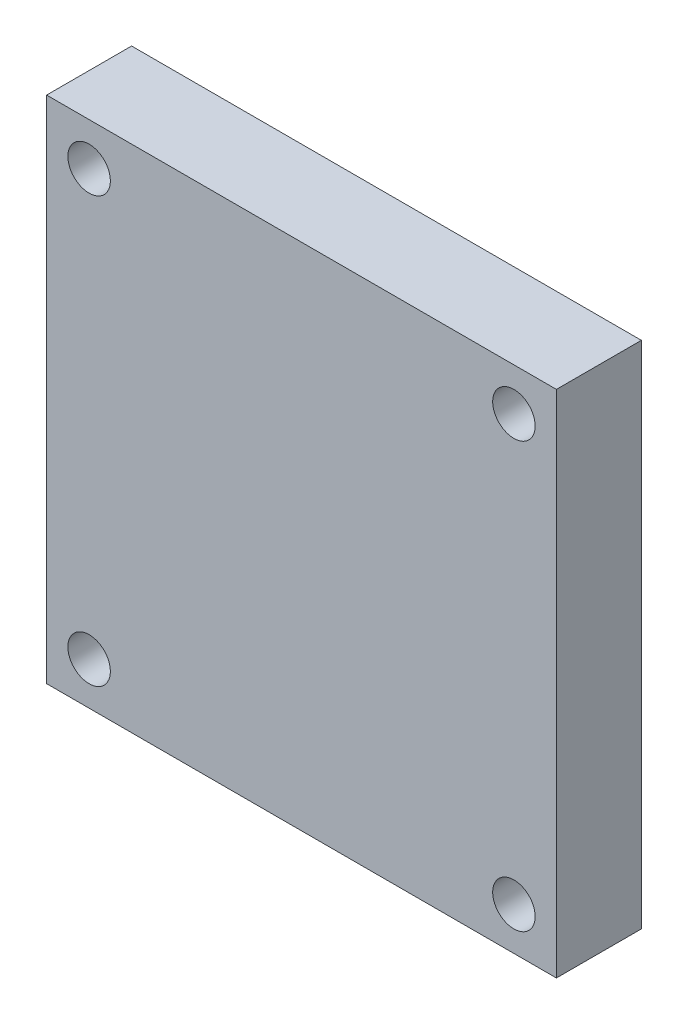
ISO-10303-21;
HEADER;
FILE_DESCRIPTION(('STEP AP214'),'2;1');
FILE_NAME('part.step','',(''),(''),'','','');
FILE_SCHEMA(('AUTOMOTIVE_DESIGN { 1 0 10303 214 1 1 1 1 }'));
ENDSEC;
DATA;
#1=APPLICATION_CONTEXT('core data for automotive mechanical design processes');
#2=APPLICATION_PROTOCOL_DEFINITION('international standard','automotive_design',2000,#1);
#3=PRODUCT_CONTEXT('',#1,'mechanical');
#4=PRODUCT('Part','Part','',(#3));
#5=PRODUCT_RELATED_PRODUCT_CATEGORY('part','',(#4));
#6=PRODUCT_DEFINITION_FORMATION('','',#4);
#7=PRODUCT_DEFINITION_CONTEXT('part definition',#1,'design');
#8=PRODUCT_DEFINITION('design','',#6,#7);
#9=PRODUCT_DEFINITION_SHAPE('','',#8);
#10=(LENGTH_UNIT() NAMED_UNIT(*) SI_UNIT(.MILLI.,.METRE.));
#11=(NAMED_UNIT(*) PLANE_ANGLE_UNIT() SI_UNIT($,.RADIAN.));
#12=(NAMED_UNIT(*) SI_UNIT($,.STERADIAN.) SOLID_ANGLE_UNIT());
#13=UNCERTAINTY_MEASURE_WITH_UNIT(LENGTH_MEASURE(1.E-05),#10,'distance_accuracy_value','');
#14=(GEOMETRIC_REPRESENTATION_CONTEXT(3) GLOBAL_UNCERTAINTY_ASSIGNED_CONTEXT((#13)) GLOBAL_UNIT_ASSIGNED_CONTEXT((#10,
#11,#12)) REPRESENTATION_CONTEXT('',''));
#15=CARTESIAN_POINT('',(0.,0.,0.));
#16=DIRECTION('',(0.,0.,1.));
#17=DIRECTION('',(1.,0.,0.));
#18=AXIS2_PLACEMENT_3D('',#15,#16,#17);
#19=CARTESIAN_POINT('',(0.,0.,10.));
#20=DIRECTION('',(0.,0.,-1.));
#21=DIRECTION('',(-1.,0.,0.));
#22=AXIS2_PLACEMENT_3D('',#19,#20,#21);
#23=PLANE('',#22);
#24=DIRECTION('',(0.,1.,0.));
#25=VECTOR('',#24,1.);
#26=CARTESIAN_POINT('',(30.,-30.,10.));
#27=LINE('',#26,#25);
#28=CARTESIAN_POINT('',(30.,-30.,10.));
#29=VERTEX_POINT('',#28);
#30=CARTESIAN_POINT('',(30.,30.,10.));
#31=VERTEX_POINT('',#30);
#32=EDGE_CURVE('E98',#29,#31,#27,.T.);
#33=ORIENTED_EDGE('',*,*,#32,.T.);
#34=DIRECTION('',(-1.,0.,0.));
#35=VECTOR('',#34,1.);
#36=CARTESIAN_POINT('',(-30.,30.,10.));
#37=LINE('',#36,#35);
#38=CARTESIAN_POINT('',(-30.,30.,10.));
#39=VERTEX_POINT('',#38);
#40=EDGE_CURVE('E93',#31,#39,#37,.T.);
#41=ORIENTED_EDGE('',*,*,#40,.T.);
#42=DIRECTION('',(0.,-1.,0.));
#43=VECTOR('',#42,1.);
#44=CARTESIAN_POINT('',(-30.,-30.,10.));
#45=LINE('',#44,#43);
#46=CARTESIAN_POINT('',(-30.,-30.,10.));
#47=VERTEX_POINT('',#46);
#48=EDGE_CURVE('E96',#39,#47,#45,.T.);
#49=ORIENTED_EDGE('',*,*,#48,.T.);
#50=DIRECTION('',(1.,0.,0.));
#51=VECTOR('',#50,1.);
#52=CARTESIAN_POINT('',(-30.,-30.,10.));
#53=LINE('',#52,#51);
#54=EDGE_CURVE('E63',#47,#29,#53,.T.);
#55=ORIENTED_EDGE('',*,*,#54,.T.);
#56=EDGE_LOOP('',(#33,#41,#49,#55));
#57=FACE_BOUND('',#56,.T.);
#58=CARTESIAN_POINT('',(-25.,25.,10.));
#59=DIRECTION('',(0.,0.,1.));
#60=DIRECTION('',(1.,0.,0.));
#61=AXIS2_PLACEMENT_3D('',#58,#59,#60);
#62=CIRCLE('',#61,2.5);
#63=CARTESIAN_POINT('',(-22.5,25.,10.));
#64=VERTEX_POINT('',#63);
#65=EDGE_CURVE('E118',#64,#64,#62,.T.);
#66=ORIENTED_EDGE('',*,*,#65,.F.);
#67=EDGE_LOOP('',(#66));
#68=FACE_BOUND('',#67,.T.);
#69=CARTESIAN_POINT('',(25.,25.,10.));
#70=DIRECTION('',(0.,0.,1.));
#71=DIRECTION('',(1.,0.,0.));
#72=AXIS2_PLACEMENT_3D('',#69,#70,#71);
#73=CIRCLE('',#72,2.5);
#74=CARTESIAN_POINT('',(27.5,25.,10.));
#75=VERTEX_POINT('',#74);
#76=EDGE_CURVE('E140',#75,#75,#73,.T.);
#77=ORIENTED_EDGE('',*,*,#76,.F.);
#78=EDGE_LOOP('',(#77));
#79=FACE_BOUND('',#78,.T.);
#80=CARTESIAN_POINT('',(25.,-25.,10.));
#81=DIRECTION('',(0.,0.,1.));
#82=DIRECTION('',(1.,0.,0.));
#83=AXIS2_PLACEMENT_3D('',#80,#81,#82);
#84=CIRCLE('',#83,2.5);
#85=CARTESIAN_POINT('',(27.5,-25.,10.));
#86=VERTEX_POINT('',#85);
#87=EDGE_CURVE('E148',#86,#86,#84,.T.);
#88=ORIENTED_EDGE('',*,*,#87,.F.);
#89=EDGE_LOOP('',(#88));
#90=FACE_BOUND('',#89,.T.);
#91=CARTESIAN_POINT('',(-25.,-25.,10.));
#92=DIRECTION('',(0.,0.,1.));
#93=DIRECTION('',(1.,0.,0.));
#94=AXIS2_PLACEMENT_3D('',#91,#92,#93);
#95=CIRCLE('',#94,2.5);
#96=CARTESIAN_POINT('',(-22.5,-25.,10.));
#97=VERTEX_POINT('',#96);
#98=EDGE_CURVE('E156',#97,#97,#95,.T.);
#99=ORIENTED_EDGE('',*,*,#98,.F.);
#100=EDGE_LOOP('',(#99));
#101=FACE_BOUND('',#100,.T.);
#102=ADVANCED_FACE('F45',(#57,#68,#79,#90,#101),#23,.F.);
#103=CARTESIAN_POINT('',(0.,0.,0.));
#104=DIRECTION('',(0.,0.,-1.));
#105=DIRECTION('',(-1.,0.,0.));
#106=AXIS2_PLACEMENT_3D('',#103,#104,#105);
#107=PLANE('',#106);
#108=CARTESIAN_POINT('',(25.,-25.,0.));
#109=DIRECTION('',(0.,0.,1.));
#110=DIRECTION('',(1.,0.,0.));
#111=AXIS2_PLACEMENT_3D('',#108,#109,#110);
#112=CIRCLE('',#111,2.5);
#113=CARTESIAN_POINT('',(27.5,-25.,0.));
#114=VERTEX_POINT('',#113);
#115=EDGE_CURVE('E152',#114,#114,#112,.T.);
#116=ORIENTED_EDGE('',*,*,#115,.T.);
#117=EDGE_LOOP('',(#116));
#118=FACE_BOUND('',#117,.T.);
#119=CARTESIAN_POINT('',(-25.,25.,0.));
#120=DIRECTION('',(0.,0.,1.));
#121=DIRECTION('',(1.,0.,0.));
#122=AXIS2_PLACEMENT_3D('',#119,#120,#121);
#123=CIRCLE('',#122,2.5);
#124=CARTESIAN_POINT('',(-22.5,25.,0.));
#125=VERTEX_POINT('',#124);
#126=EDGE_CURVE('E136',#125,#125,#123,.T.);
#127=ORIENTED_EDGE('',*,*,#126,.T.);
#128=EDGE_LOOP('',(#127));
#129=FACE_BOUND('',#128,.T.);
#130=DIRECTION('',(0.,1.,0.));
#131=VECTOR('',#130,1.);
#132=CARTESIAN_POINT('',(30.,-30.,0.));
#133=LINE('',#132,#131);
#134=CARTESIAN_POINT('',(30.,-30.,0.));
#135=VERTEX_POINT('',#134);
#136=CARTESIAN_POINT('',(30.,30.,0.));
#137=VERTEX_POINT('',#136);
#138=EDGE_CURVE('E114',#135,#137,#133,.T.);
#139=ORIENTED_EDGE('',*,*,#138,.F.);
#140=DIRECTION('',(1.,0.,0.));
#141=VECTOR('',#140,1.);
#142=CARTESIAN_POINT('',(-30.,-30.,0.));
#143=LINE('',#142,#141);
#144=CARTESIAN_POINT('',(-30.,-30.,0.));
#145=VERTEX_POINT('',#144);
#146=EDGE_CURVE('E86',#145,#135,#143,.T.);
#147=ORIENTED_EDGE('',*,*,#146,.F.);
#148=DIRECTION('',(0.,-1.,0.));
#149=VECTOR('',#148,1.);
#150=CARTESIAN_POINT('',(-30.,-30.,0.));
#151=LINE('',#150,#149);
#152=CARTESIAN_POINT('',(-30.,30.,0.));
#153=VERTEX_POINT('',#152);
#154=EDGE_CURVE('E80',#153,#145,#151,.T.);
#155=ORIENTED_EDGE('',*,*,#154,.F.);
#156=DIRECTION('',(-1.,0.,0.));
#157=VECTOR('',#156,1.);
#158=CARTESIAN_POINT('',(-30.,30.,0.));
#159=LINE('',#158,#157);
#160=EDGE_CURVE('E103',#137,#153,#159,.T.);
#161=ORIENTED_EDGE('',*,*,#160,.F.);
#162=EDGE_LOOP('',(#139,#147,#155,#161));
#163=FACE_BOUND('',#162,.T.);
#164=CARTESIAN_POINT('',(25.,25.,0.));
#165=DIRECTION('',(0.,0.,1.));
#166=DIRECTION('',(1.,0.,0.));
#167=AXIS2_PLACEMENT_3D('',#164,#165,#166);
#168=CIRCLE('',#167,2.5);
#169=CARTESIAN_POINT('',(27.5,25.,0.));
#170=VERTEX_POINT('',#169);
#171=EDGE_CURVE('E144',#170,#170,#168,.T.);
#172=ORIENTED_EDGE('',*,*,#171,.T.);
#173=EDGE_LOOP('',(#172));
#174=FACE_BOUND('',#173,.T.);
#175=CARTESIAN_POINT('',(-25.,-25.,0.));
#176=DIRECTION('',(0.,0.,1.));
#177=DIRECTION('',(1.,0.,0.));
#178=AXIS2_PLACEMENT_3D('',#175,#176,#177);
#179=CIRCLE('',#178,2.5);
#180=CARTESIAN_POINT('',(-22.5,-25.,0.));
#181=VERTEX_POINT('',#180);
#182=EDGE_CURVE('E160',#181,#181,#179,.T.);
#183=ORIENTED_EDGE('',*,*,#182,.T.);
#184=EDGE_LOOP('',(#183));
#185=FACE_BOUND('',#184,.T.);
#186=ADVANCED_FACE('F131',(#118,#129,#163,#174,#185),#107,.T.);
#187=CARTESIAN_POINT('',(30.,-30.,10.));
#188=DIRECTION('',(-1.,0.,0.));
#189=DIRECTION('',(0.,0.,1.));
#190=AXIS2_PLACEMENT_3D('',#187,#188,#189);
#191=PLANE('',#190);
#192=ORIENTED_EDGE('',*,*,#138,.T.);
#193=DIRECTION('',(0.,0.,-1.));
#194=VECTOR('',#193,1.);
#195=CARTESIAN_POINT('',(30.,30.,10.));
#196=LINE('',#195,#194);
#197=EDGE_CURVE('E11',#31,#137,#196,.T.);
#198=ORIENTED_EDGE('',*,*,#197,.F.);
#199=ORIENTED_EDGE('',*,*,#32,.F.);
#200=DIRECTION('',(0.,0.,-1.));
#201=VECTOR('',#200,1.);
#202=CARTESIAN_POINT('',(30.,-30.,10.));
#203=LINE('',#202,#201);
#204=EDGE_CURVE('E110',#29,#135,#203,.T.);
#205=ORIENTED_EDGE('',*,*,#204,.T.);
#206=EDGE_LOOP('',(#192,#198,#199,#205));
#207=FACE_BOUND('',#206,.T.);
#208=ADVANCED_FACE('F47',(#207),#191,.F.);
#209=CARTESIAN_POINT('',(-30.,30.,10.));
#210=DIRECTION('',(0.,-1.,0.));
#211=DIRECTION('',(0.,0.,-1.));
#212=AXIS2_PLACEMENT_3D('',#209,#210,#211);
#213=PLANE('',#212);
#214=ORIENTED_EDGE('',*,*,#160,.T.);
#215=DIRECTION('',(0.,0.,-1.));
#216=VECTOR('',#215,1.);
#217=CARTESIAN_POINT('',(-30.,30.,10.));
#218=LINE('',#217,#216);
#219=EDGE_CURVE('E55',#39,#153,#218,.T.);
#220=ORIENTED_EDGE('',*,*,#219,.F.);
#221=ORIENTED_EDGE('',*,*,#40,.F.);
#222=ORIENTED_EDGE('',*,*,#197,.T.);
#223=EDGE_LOOP('',(#214,#220,#221,#222));
#224=FACE_BOUND('',#223,.T.);
#225=ADVANCED_FACE('F102',(#224),#213,.F.);
#226=CARTESIAN_POINT('',(-30.,-30.,10.));
#227=DIRECTION('',(1.,0.,0.));
#228=DIRECTION('',(0.,0.,-1.));
#229=AXIS2_PLACEMENT_3D('',#226,#227,#228);
#230=PLANE('',#229);
#231=ORIENTED_EDGE('',*,*,#154,.T.);
#232=DIRECTION('',(0.,0.,-1.));
#233=VECTOR('',#232,1.);
#234=CARTESIAN_POINT('',(-30.,-30.,10.));
#235=LINE('',#234,#233);
#236=EDGE_CURVE('E105',#47,#145,#235,.T.);
#237=ORIENTED_EDGE('',*,*,#236,.F.);
#238=ORIENTED_EDGE('',*,*,#48,.F.);
#239=ORIENTED_EDGE('',*,*,#219,.T.);
#240=EDGE_LOOP('',(#231,#237,#238,#239));
#241=FACE_BOUND('',#240,.T.);
#242=ADVANCED_FACE('F106',(#241),#230,.F.);
#243=CARTESIAN_POINT('',(-30.,-30.,10.));
#244=DIRECTION('',(0.,1.,0.));
#245=DIRECTION('',(0.,0.,1.));
#246=AXIS2_PLACEMENT_3D('',#243,#244,#245);
#247=PLANE('',#246);
#248=ORIENTED_EDGE('',*,*,#146,.T.);
#249=ORIENTED_EDGE('',*,*,#204,.F.);
#250=ORIENTED_EDGE('',*,*,#54,.F.);
#251=ORIENTED_EDGE('',*,*,#236,.T.);
#252=EDGE_LOOP('',(#248,#249,#250,#251));
#253=FACE_BOUND('',#252,.T.);
#254=ADVANCED_FACE('F128',(#253),#247,.F.);
#255=CARTESIAN_POINT('',(-25.,25.,10.));
#256=DIRECTION('',(0.,0.,-1.));
#257=DIRECTION('',(-1.,0.,0.));
#258=AXIS2_PLACEMENT_3D('',#255,#256,#257);
#259=CYLINDRICAL_SURFACE('',#258,2.5);
#260=ORIENTED_EDGE('',*,*,#65,.T.);
#261=EDGE_LOOP('',(#260));
#262=FACE_BOUND('',#261,.T.);
#263=ORIENTED_EDGE('',*,*,#126,.F.);
#264=EDGE_LOOP('',(#263));
#265=FACE_BOUND('',#264,.T.);
#266=ADVANCED_FACE('F179',(#262,#265),#259,.F.);
#267=CARTESIAN_POINT('',(25.,25.,10.));
#268=DIRECTION('',(0.,0.,-1.));
#269=DIRECTION('',(-1.,0.,0.));
#270=AXIS2_PLACEMENT_3D('',#267,#268,#269);
#271=CYLINDRICAL_SURFACE('',#270,2.5);
#272=ORIENTED_EDGE('',*,*,#76,.T.);
#273=EDGE_LOOP('',(#272));
#274=FACE_BOUND('',#273,.T.);
#275=ORIENTED_EDGE('',*,*,#171,.F.);
#276=EDGE_LOOP('',(#275));
#277=FACE_BOUND('',#276,.T.);
#278=ADVANCED_FACE('F224',(#274,#277),#271,.F.);
#279=CARTESIAN_POINT('',(25.,-25.,10.));
#280=DIRECTION('',(0.,0.,-1.));
#281=DIRECTION('',(-1.,0.,0.));
#282=AXIS2_PLACEMENT_3D('',#279,#280,#281);
#283=CYLINDRICAL_SURFACE('',#282,2.5);
#284=ORIENTED_EDGE('',*,*,#87,.T.);
#285=EDGE_LOOP('',(#284));
#286=FACE_BOUND('',#285,.T.);
#287=ORIENTED_EDGE('',*,*,#115,.F.);
#288=EDGE_LOOP('',(#287));
#289=FACE_BOUND('',#288,.T.);
#290=ADVANCED_FACE('F232',(#286,#289),#283,.F.);
#291=CARTESIAN_POINT('',(-25.,-25.,10.));
#292=DIRECTION('',(0.,0.,-1.));
#293=DIRECTION('',(-1.,0.,0.));
#294=AXIS2_PLACEMENT_3D('',#291,#292,#293);
#295=CYLINDRICAL_SURFACE('',#294,2.5);
#296=ORIENTED_EDGE('',*,*,#98,.T.);
#297=EDGE_LOOP('',(#296));
#298=FACE_BOUND('',#297,.T.);
#299=ORIENTED_EDGE('',*,*,#182,.F.);
#300=EDGE_LOOP('',(#299));
#301=FACE_BOUND('',#300,.T.);
#302=ADVANCED_FACE('F168',(#298,#301),#295,.F.);
#303=CLOSED_SHELL('',(#102,#186,#208,#225,#242,#254,#266,#278,#290,#302));
#304=MANIFOLD_SOLID_BREP('B2',#303);
#305=ADVANCED_BREP_SHAPE_REPRESENTATION('',(#18,#304),#14);
#306=SHAPE_DEFINITION_REPRESENTATION(#9,#305);
ENDSEC;
END-ISO-10303-21;
